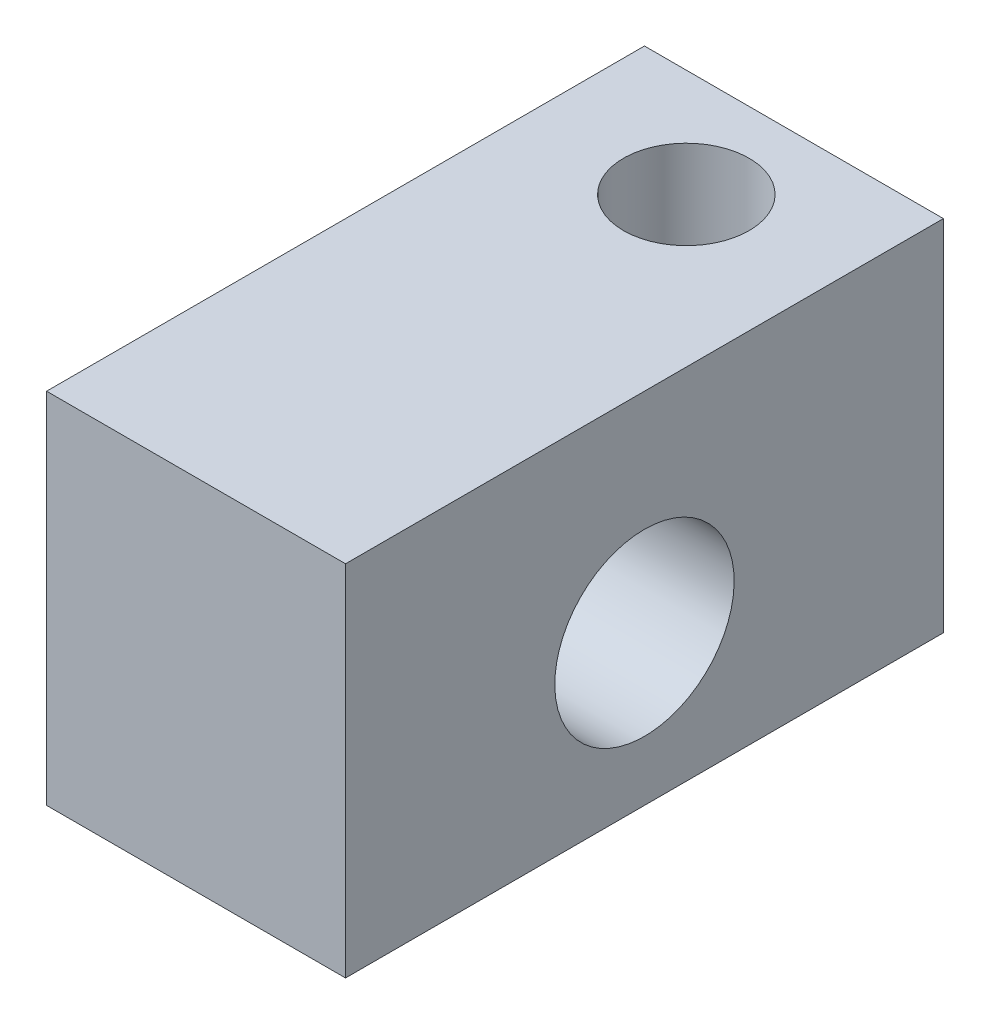
ISO-10303-21;
HEADER;
FILE_DESCRIPTION(('STEP AP214'),'2;1');
FILE_NAME('part.step','',(''),(''),'','','');
FILE_SCHEMA(('AUTOMOTIVE_DESIGN { 1 0 10303 214 1 1 1 1 }'));
ENDSEC;
DATA;
#1=APPLICATION_CONTEXT('core data for automotive mechanical design processes');
#2=APPLICATION_PROTOCOL_DEFINITION('international standard','automotive_design',2000,#1);
#3=PRODUCT_CONTEXT('',#1,'mechanical');
#4=PRODUCT('Part','Part','',(#3));
#5=PRODUCT_RELATED_PRODUCT_CATEGORY('part','',(#4));
#6=PRODUCT_DEFINITION_FORMATION('','',#4);
#7=PRODUCT_DEFINITION_CONTEXT('part definition',#1,'design');
#8=PRODUCT_DEFINITION('design','',#6,#7);
#9=PRODUCT_DEFINITION_SHAPE('','',#8);
#10=(LENGTH_UNIT() NAMED_UNIT(*) SI_UNIT(.MILLI.,.METRE.));
#11=(NAMED_UNIT(*) PLANE_ANGLE_UNIT() SI_UNIT($,.RADIAN.));
#12=(NAMED_UNIT(*) SI_UNIT($,.STERADIAN.) SOLID_ANGLE_UNIT());
#13=UNCERTAINTY_MEASURE_WITH_UNIT(LENGTH_MEASURE(1.E-05),#10,'distance_accuracy_value','');
#14=(GEOMETRIC_REPRESENTATION_CONTEXT(3) GLOBAL_UNCERTAINTY_ASSIGNED_CONTEXT((#13)) GLOBAL_UNIT_ASSIGNED_CONTEXT((#10,
#11,#12)) REPRESENTATION_CONTEXT('',''));
#15=CARTESIAN_POINT('',(0.,0.,0.));
#16=DIRECTION('',(0.,0.,1.));
#17=DIRECTION('',(1.,0.,0.));
#18=AXIS2_PLACEMENT_3D('',#15,#16,#17);
#19=CARTESIAN_POINT('',(0.,0.,10.));
#20=DIRECTION('',(1.,0.,0.));
#21=DIRECTION('',(0.,1.,0.));
#22=AXIS2_PLACEMENT_3D('',#19,#20,#21);
#23=PLANE('',#22);
#24=CARTESIAN_POINT('',(0.,-3.5,5.));
#25=DIRECTION('',(1.,0.,0.));
#26=DIRECTION('',(0.,1.,0.));
#27=AXIS2_PLACEMENT_3D('',#24,#25,#26);
#28=CIRCLE('',#27,1.5);
#29=CARTESIAN_POINT('',(0.,-2.,5.));
#30=VERTEX_POINT('',#29);
#31=EDGE_CURVE('E99',#30,#30,#28,.F.);
#32=ORIENTED_EDGE('',*,*,#31,.F.);
#33=EDGE_LOOP('',(#32));
#34=FACE_BOUND('',#33,.T.);
#35=DIRECTION('',(0.,-1.,0.));
#36=VECTOR('',#35,1.);
#37=CARTESIAN_POINT('',(0.,0.,0.));
#38=LINE('',#37,#36);
#39=CARTESIAN_POINT('',(0.,0.,0.));
#40=VERTEX_POINT('',#39);
#41=CARTESIAN_POINT('',(0.,-6.,0.));
#42=VERTEX_POINT('',#41);
#43=EDGE_CURVE('E96',#40,#42,#38,.T.);
#44=ORIENTED_EDGE('',*,*,#43,.T.);
#45=DIRECTION('',(0.,0.,-1.));
#46=VECTOR('',#45,1.);
#47=CARTESIAN_POINT('',(0.,-6.,10.));
#48=LINE('',#47,#46);
#49=CARTESIAN_POINT('',(0.,-6.,10.));
#50=VERTEX_POINT('',#49);
#51=EDGE_CURVE('E11',#50,#42,#48,.T.);
#52=ORIENTED_EDGE('',*,*,#51,.F.);
#53=DIRECTION('',(0.,-1.,0.));
#54=VECTOR('',#53,1.);
#55=CARTESIAN_POINT('',(0.,0.,10.));
#56=LINE('',#55,#54);
#57=CARTESIAN_POINT('',(0.,0.,10.));
#58=VERTEX_POINT('',#57);
#59=EDGE_CURVE('E84',#58,#50,#56,.T.);
#60=ORIENTED_EDGE('',*,*,#59,.F.);
#61=DIRECTION('',(0.,0.,-1.));
#62=VECTOR('',#61,1.);
#63=CARTESIAN_POINT('',(0.,0.,10.));
#64=LINE('',#63,#62);
#65=EDGE_CURVE('E92',#58,#40,#64,.T.);
#66=ORIENTED_EDGE('',*,*,#65,.T.);
#67=EDGE_LOOP('',(#44,#52,#60,#66));
#68=FACE_BOUND('',#67,.T.);
#69=ADVANCED_FACE('F33',(#34,#68),#23,.F.);
#70=CARTESIAN_POINT('',(0.,-6.,10.));
#71=DIRECTION('',(0.,1.,0.));
#72=DIRECTION('',(0.,0.,1.));
#73=AXIS2_PLACEMENT_3D('',#70,#71,#72);
#74=PLANE('',#73);
#75=CARTESIAN_POINT('',(2.5,-6.,8.2));
#76=DIRECTION('',(0.,-1.,0.));
#77=DIRECTION('',(0.,0.,-1.));
#78=AXIS2_PLACEMENT_3D('',#75,#76,#77);
#79=CIRCLE('',#78,1.05);
#80=CARTESIAN_POINT('',(2.5,-6.,7.15));
#81=VERTEX_POINT('',#80);
#82=EDGE_CURVE('E122',#81,#81,#79,.T.);
#83=ORIENTED_EDGE('',*,*,#82,.F.);
#84=EDGE_LOOP('',(#83));
#85=FACE_BOUND('',#84,.T.);
#86=DIRECTION('',(1.,0.,0.));
#87=VECTOR('',#86,1.);
#88=CARTESIAN_POINT('',(0.,-6.,0.));
#89=LINE('',#88,#87);
#90=CARTESIAN_POINT('',(5.,-6.,0.));
#91=VERTEX_POINT('',#90);
#92=EDGE_CURVE('E88',#42,#91,#89,.T.);
#93=ORIENTED_EDGE('',*,*,#92,.T.);
#94=DIRECTION('',(0.,0.,-1.));
#95=VECTOR('',#94,1.);
#96=CARTESIAN_POINT('',(5.,-6.,10.));
#97=LINE('',#96,#95);
#98=CARTESIAN_POINT('',(5.,-6.,10.));
#99=VERTEX_POINT('',#98);
#100=EDGE_CURVE('E41',#99,#91,#97,.T.);
#101=ORIENTED_EDGE('',*,*,#100,.F.);
#102=DIRECTION('',(1.,0.,0.));
#103=VECTOR('',#102,1.);
#104=CARTESIAN_POINT('',(0.,-6.,10.));
#105=LINE('',#104,#103);
#106=EDGE_CURVE('E79',#50,#99,#105,.T.);
#107=ORIENTED_EDGE('',*,*,#106,.F.);
#108=ORIENTED_EDGE('',*,*,#51,.T.);
#109=EDGE_LOOP('',(#93,#101,#107,#108));
#110=FACE_BOUND('',#109,.T.);
#111=ADVANCED_FACE('F87',(#85,#110),#74,.F.);
#112=CARTESIAN_POINT('',(5.,0.,10.));
#113=DIRECTION('',(-1.,0.,0.));
#114=DIRECTION('',(0.,-1.,0.));
#115=AXIS2_PLACEMENT_3D('',#112,#113,#114);
#116=PLANE('',#115);
#117=CARTESIAN_POINT('',(5.,-3.5,5.));
#118=DIRECTION('',(1.,0.,0.));
#119=DIRECTION('',(0.,1.,0.));
#120=AXIS2_PLACEMENT_3D('',#117,#118,#119);
#121=CIRCLE('',#120,1.5);
#122=CARTESIAN_POINT('',(5.,-2.,5.));
#123=VERTEX_POINT('',#122);
#124=EDGE_CURVE('E112',#123,#123,#121,.T.);
#125=ORIENTED_EDGE('',*,*,#124,.F.);
#126=EDGE_LOOP('',(#125));
#127=FACE_BOUND('',#126,.T.);
#128=DIRECTION('',(0.,1.,0.));
#129=VECTOR('',#128,1.);
#130=CARTESIAN_POINT('',(5.,0.,0.));
#131=LINE('',#130,#129);
#132=CARTESIAN_POINT('',(5.,0.,0.));
#133=VERTEX_POINT('',#132);
#134=EDGE_CURVE('E66',#91,#133,#131,.T.);
#135=ORIENTED_EDGE('',*,*,#134,.T.);
#136=DIRECTION('',(0.,0.,-1.));
#137=VECTOR('',#136,1.);
#138=CARTESIAN_POINT('',(5.,0.,10.));
#139=LINE('',#138,#137);
#140=CARTESIAN_POINT('',(5.,0.,10.));
#141=VERTEX_POINT('',#140);
#142=EDGE_CURVE('E89',#141,#133,#139,.T.);
#143=ORIENTED_EDGE('',*,*,#142,.F.);
#144=DIRECTION('',(0.,1.,0.));
#145=VECTOR('',#144,1.);
#146=CARTESIAN_POINT('',(5.,0.,10.));
#147=LINE('',#146,#145);
#148=EDGE_CURVE('E82',#99,#141,#147,.T.);
#149=ORIENTED_EDGE('',*,*,#148,.F.);
#150=ORIENTED_EDGE('',*,*,#100,.T.);
#151=EDGE_LOOP('',(#135,#143,#149,#150));
#152=FACE_BOUND('',#151,.T.);
#153=ADVANCED_FACE('F90',(#127,#152),#116,.F.);
#154=CARTESIAN_POINT('',(0.,0.,10.));
#155=DIRECTION('',(0.,-1.,0.));
#156=DIRECTION('',(0.,0.,-1.));
#157=AXIS2_PLACEMENT_3D('',#154,#155,#156);
#158=PLANE('',#157);
#159=CARTESIAN_POINT('',(2.5,0.,1.8));
#160=DIRECTION('',(0.,1.,0.));
#161=DIRECTION('',(0.,0.,1.));
#162=AXIS2_PLACEMENT_3D('',#159,#160,#161);
#163=CIRCLE('',#162,1.05);
#164=CARTESIAN_POINT('',(2.5,0.,2.85));
#165=VERTEX_POINT('',#164);
#166=EDGE_CURVE('E116',#165,#165,#163,.T.);
#167=ORIENTED_EDGE('',*,*,#166,.F.);
#168=EDGE_LOOP('',(#167));
#169=FACE_BOUND('',#168,.T.);
#170=DIRECTION('',(-1.,0.,0.));
#171=VECTOR('',#170,1.);
#172=CARTESIAN_POINT('',(0.,0.,0.));
#173=LINE('',#172,#171);
#174=EDGE_CURVE('E72',#133,#40,#173,.T.);
#175=ORIENTED_EDGE('',*,*,#174,.T.);
#176=ORIENTED_EDGE('',*,*,#65,.F.);
#177=DIRECTION('',(-1.,0.,0.));
#178=VECTOR('',#177,1.);
#179=CARTESIAN_POINT('',(0.,0.,10.));
#180=LINE('',#179,#178);
#181=EDGE_CURVE('E49',#141,#58,#180,.T.);
#182=ORIENTED_EDGE('',*,*,#181,.F.);
#183=ORIENTED_EDGE('',*,*,#142,.T.);
#184=EDGE_LOOP('',(#175,#176,#182,#183));
#185=FACE_BOUND('',#184,.T.);
#186=ADVANCED_FACE('F104',(#169,#185),#158,.F.);
#187=CARTESIAN_POINT('',(0.,0.,10.));
#188=DIRECTION('',(0.,0.,1.));
#189=DIRECTION('',(1.,0.,0.));
#190=AXIS2_PLACEMENT_3D('',#187,#188,#189);
#191=PLANE('',#190);
#192=ORIENTED_EDGE('',*,*,#59,.T.);
#193=ORIENTED_EDGE('',*,*,#106,.T.);
#194=ORIENTED_EDGE('',*,*,#148,.T.);
#195=ORIENTED_EDGE('',*,*,#181,.T.);
#196=EDGE_LOOP('',(#192,#193,#194,#195));
#197=FACE_BOUND('',#196,.T.);
#198=ADVANCED_FACE('F80',(#197),#191,.T.);
#199=CARTESIAN_POINT('',(0.,0.,0.));
#200=DIRECTION('',(0.,0.,1.));
#201=DIRECTION('',(1.,0.,0.));
#202=AXIS2_PLACEMENT_3D('',#199,#200,#201);
#203=PLANE('',#202);
#204=ORIENTED_EDGE('',*,*,#43,.F.);
#205=ORIENTED_EDGE('',*,*,#174,.F.);
#206=ORIENTED_EDGE('',*,*,#134,.F.);
#207=ORIENTED_EDGE('',*,*,#92,.F.);
#208=EDGE_LOOP('',(#204,#205,#206,#207));
#209=FACE_BOUND('',#208,.T.);
#210=ADVANCED_FACE('F107',(#209),#203,.F.);
#211=CARTESIAN_POINT('',(-0.001000000000001,-3.5,5.));
#212=DIRECTION('',(1.,0.,0.));
#213=DIRECTION('',(0.,1.,0.));
#214=AXIS2_PLACEMENT_3D('',#211,#212,#213);
#215=CYLINDRICAL_SURFACE('',#214,1.5);
#216=ORIENTED_EDGE('',*,*,#124,.T.);
#217=EDGE_LOOP('',(#216));
#218=FACE_BOUND('',#217,.T.);
#219=ORIENTED_EDGE('',*,*,#31,.T.);
#220=EDGE_LOOP('',(#219));
#221=FACE_BOUND('',#220,.T.);
#222=ADVANCED_FACE('F151',(#218,#221),#215,.F.);
#223=CARTESIAN_POINT('',(2.5,-3.25,1.8));
#224=DIRECTION('',(0.,1.,0.));
#225=DIRECTION('',(0.,0.,1.));
#226=AXIS2_PLACEMENT_3D('',#223,#224,#225);
#227=CYLINDRICAL_SURFACE('',#226,1.05);
#228=CARTESIAN_POINT('',(2.5,-3.25,1.8));
#229=DIRECTION('',(0.,1.,0.));
#230=DIRECTION('',(0.,0.,1.));
#231=AXIS2_PLACEMENT_3D('',#228,#229,#230);
#232=CIRCLE('',#231,1.05);
#233=CARTESIAN_POINT('',(2.5,-3.25,2.85));
#234=VERTEX_POINT('',#233);
#235=EDGE_CURVE('E115',#234,#234,#232,.T.);
#236=CARTESIAN_POINT('',(2.5,-3.25,2.85));
#237=CARTESIAN_POINT('',(2.5,-3.21614583333333,2.85));
#238=CARTESIAN_POINT('',(2.5,-3.18229166666667,2.85));
#239=CARTESIAN_POINT('',(2.5,-3.11458333333333,2.85));
#240=CARTESIAN_POINT('',(2.5,-3.08072916666667,2.85));
#241=CARTESIAN_POINT('',(2.5,-3.01302083333333,2.85));
#242=CARTESIAN_POINT('',(2.5,-2.97916666666667,2.85));
#243=CARTESIAN_POINT('',(2.5,-2.91145833333333,2.85));
#244=CARTESIAN_POINT('',(2.5,-2.87760416666667,2.85));
#245=CARTESIAN_POINT('',(2.5,-2.80989583333333,2.85));
#246=CARTESIAN_POINT('',(2.5,-2.77604166666667,2.85));
#247=CARTESIAN_POINT('',(2.5,-2.70833333333333,2.85));
#248=CARTESIAN_POINT('',(2.5,-2.67447916666667,2.85));
#249=CARTESIAN_POINT('',(2.5,-2.60677083333333,2.85));
#250=CARTESIAN_POINT('',(2.5,-2.57291666666667,2.85));
#251=CARTESIAN_POINT('',(2.5,-2.50520833333333,2.85));
#252=CARTESIAN_POINT('',(2.5,-2.47135416666667,2.85));
#253=CARTESIAN_POINT('',(2.5,-2.40364583333333,2.85));
#254=CARTESIAN_POINT('',(2.5,-2.36979166666667,2.85));
#255=CARTESIAN_POINT('',(2.5,-2.30208333333333,2.85));
#256=CARTESIAN_POINT('',(2.5,-2.26822916666667,2.85));
#257=CARTESIAN_POINT('',(2.5,-2.20052083333333,2.85));
#258=CARTESIAN_POINT('',(2.5,-2.16666666666667,2.85));
#259=CARTESIAN_POINT('',(2.5,-2.09895833333333,2.85));
#260=CARTESIAN_POINT('',(2.5,-2.06510416666667,2.85));
#261=CARTESIAN_POINT('',(2.5,-1.99739583333333,2.85));
#262=CARTESIAN_POINT('',(2.5,-1.96354166666667,2.85));
#263=CARTESIAN_POINT('',(2.5,-1.89583333333333,2.85));
#264=CARTESIAN_POINT('',(2.5,-1.86197916666667,2.85));
#265=CARTESIAN_POINT('',(2.5,-1.79427083333333,2.85));
#266=CARTESIAN_POINT('',(2.5,-1.76041666666667,2.85));
#267=CARTESIAN_POINT('',(2.5,-1.69270833333333,2.85));
#268=CARTESIAN_POINT('',(2.5,-1.65885416666667,2.85));
#269=CARTESIAN_POINT('',(2.5,-1.59114583333333,2.85));
#270=CARTESIAN_POINT('',(2.5,-1.55729166666667,2.85));
#271=CARTESIAN_POINT('',(2.5,-1.48958333333333,2.85));
#272=CARTESIAN_POINT('',(2.5,-1.45572916666667,2.85));
#273=CARTESIAN_POINT('',(2.5,-1.38802083333333,2.85));
#274=CARTESIAN_POINT('',(2.5,-1.35416666666667,2.85));
#275=CARTESIAN_POINT('',(2.5,-1.28645833333333,2.85));
#276=CARTESIAN_POINT('',(2.5,-1.25260416666667,2.85));
#277=CARTESIAN_POINT('',(2.5,-1.18489583333333,2.85));
#278=CARTESIAN_POINT('',(2.5,-1.15104166666667,2.85));
#279=CARTESIAN_POINT('',(2.5,-1.08333333333333,2.85));
#280=CARTESIAN_POINT('',(2.5,-1.04947916666667,2.85));
#281=CARTESIAN_POINT('',(2.5,-0.981770833333333,2.85));
#282=CARTESIAN_POINT('',(2.5,-0.947916666666667,2.85));
#283=CARTESIAN_POINT('',(2.5,-0.880208333333334,2.85));
#284=CARTESIAN_POINT('',(2.5,-0.846354166666667,2.85));
#285=CARTESIAN_POINT('',(2.5,-0.778645833333334,2.85));
#286=CARTESIAN_POINT('',(2.5,-0.744791666666667,2.85));
#287=CARTESIAN_POINT('',(2.5,-0.677083333333333,2.85));
#288=CARTESIAN_POINT('',(2.5,-0.643229166666667,2.85));
#289=CARTESIAN_POINT('',(2.5,-0.575520833333333,2.85));
#290=CARTESIAN_POINT('',(2.5,-0.541666666666667,2.85));
#291=CARTESIAN_POINT('',(2.5,-0.473958333333333,2.85));
#292=CARTESIAN_POINT('',(2.5,-0.440104166666667,2.85));
#293=CARTESIAN_POINT('',(2.5,-0.372395833333333,2.85));
#294=CARTESIAN_POINT('',(2.5,-0.338541666666667,2.85));
#295=CARTESIAN_POINT('',(2.5,-0.270833333333334,2.85));
#296=CARTESIAN_POINT('',(2.5,-0.236979166666667,2.85));
#297=CARTESIAN_POINT('',(2.5,-0.169270833333334,2.85));
#298=CARTESIAN_POINT('',(2.5,-0.135416666666667,2.85));
#299=CARTESIAN_POINT('',(2.5,-0.0677083333333334,2.85));
#300=CARTESIAN_POINT('',(2.5,-0.0338541666666667,2.85));
#301=CARTESIAN_POINT('',(2.5,0.,2.85));
#302=B_SPLINE_CURVE_WITH_KNOTS('',3,(#236,#237,#238,#239,#240,#241,#242,#243,#244,#245,#246,
#247,#248,#249,#250,#251,#252,#253,#254,#255,#256,#257,#258,#259,#260,#261,#262,#263,#264,#265,
#266,#267,#268,#269,#270,#271,#272,#273,#274,#275,#276,#277,#278,#279,#280,#281,#282,#283,#284,
#285,#286,#287,#288,#289,#290,#291,#292,#293,#294,#295,#296,#297,#298,#299,#300,#301),
.UNSPECIFIED.,.F.,.F.,(4,2,2,2,2,2,2,2,2,2,2,2,2,2,2,2,2,2,2,2,2,2,2,2,2,2,2,2,2,2,2,2,4),(0.,
0.1015625,0.203125,0.3046875,0.40625,0.5078125,0.609375,0.7109375,0.8125,0.9140625,1.015625,
1.1171875,1.21875,1.3203125,1.421875,1.5234375,1.625,1.7265625,1.828125,1.9296875,2.03125,
2.1328125,2.234375,2.3359375,2.4375,2.5390625,2.640625,2.7421875,2.84375,2.9453125,3.046875,
3.1484375,3.25),.UNSPECIFIED.);
#303=EDGE_CURVE('BSEAM156',#234,#165,#302,.T.);
#304=ORIENTED_EDGE('',*,*,#235,.F.);
#305=ORIENTED_EDGE('',*,*,#166,.T.);
#306=ORIENTED_EDGE('',*,*,#303,.T.);
#307=ORIENTED_EDGE('',*,*,#303,.F.);
#308=EDGE_LOOP('',(#304,#306,#305,#307));
#309=FACE_BOUND('',#308,.T.);
#310=ADVANCED_FACE('F156',(#309),#227,.F.);
#311=CARTESIAN_POINT('',(2.5,-3.25,1.8));
#312=DIRECTION('',(0.,1.,0.));
#313=DIRECTION('',(0.,0.,1.));
#314=AXIS2_PLACEMENT_3D('',#311,#312,#313);
#315=PLANE('',#314);
#316=ORIENTED_EDGE('',*,*,#235,.T.);
#317=EDGE_LOOP('',(#316));
#318=FACE_BOUND('',#317,.T.);
#319=ADVANCED_FACE('F133',(#318),#315,.T.);
#320=CARTESIAN_POINT('',(2.5,-4.25,8.2));
#321=DIRECTION('',(0.,-1.,0.));
#322=DIRECTION('',(0.,0.,-1.));
#323=AXIS2_PLACEMENT_3D('',#320,#321,#322);
#324=CYLINDRICAL_SURFACE('',#323,1.05);
#325=CARTESIAN_POINT('',(2.5,-4.25,8.2));
#326=DIRECTION('',(0.,-1.,0.));
#327=DIRECTION('',(0.,0.,-1.));
#328=AXIS2_PLACEMENT_3D('',#325,#326,#327);
#329=CIRCLE('',#328,1.05);
#330=CARTESIAN_POINT('',(2.5,-4.25,7.15));
#331=VERTEX_POINT('',#330);
#332=EDGE_CURVE('E119',#331,#331,#329,.T.);
#333=ORIENTED_EDGE('',*,*,#332,.F.);
#334=EDGE_LOOP('',(#333));
#335=FACE_BOUND('',#334,.T.);
#336=ORIENTED_EDGE('',*,*,#82,.T.);
#337=EDGE_LOOP('',(#336));
#338=FACE_BOUND('',#337,.T.);
#339=ADVANCED_FACE('F130',(#335,#338),#324,.F.);
#340=CARTESIAN_POINT('',(2.5,-4.25,8.2));
#341=DIRECTION('',(0.,-1.,0.));
#342=DIRECTION('',(0.,0.,-1.));
#343=AXIS2_PLACEMENT_3D('',#340,#341,#342);
#344=PLANE('',#343);
#345=ORIENTED_EDGE('',*,*,#332,.T.);
#346=EDGE_LOOP('',(#345));
#347=FACE_BOUND('',#346,.T.);
#348=ADVANCED_FACE('F128',(#347),#344,.T.);
#349=CLOSED_SHELL('',(#69,#111,#153,#186,#198,#210,#222,#310,#319,#339,#348));
#350=MANIFOLD_SOLID_BREP('B2',#349);
#351=ADVANCED_BREP_SHAPE_REPRESENTATION('',(#18,#350),#14);
#352=SHAPE_DEFINITION_REPRESENTATION(#9,#351);
ENDSEC;
END-ISO-10303-21;
